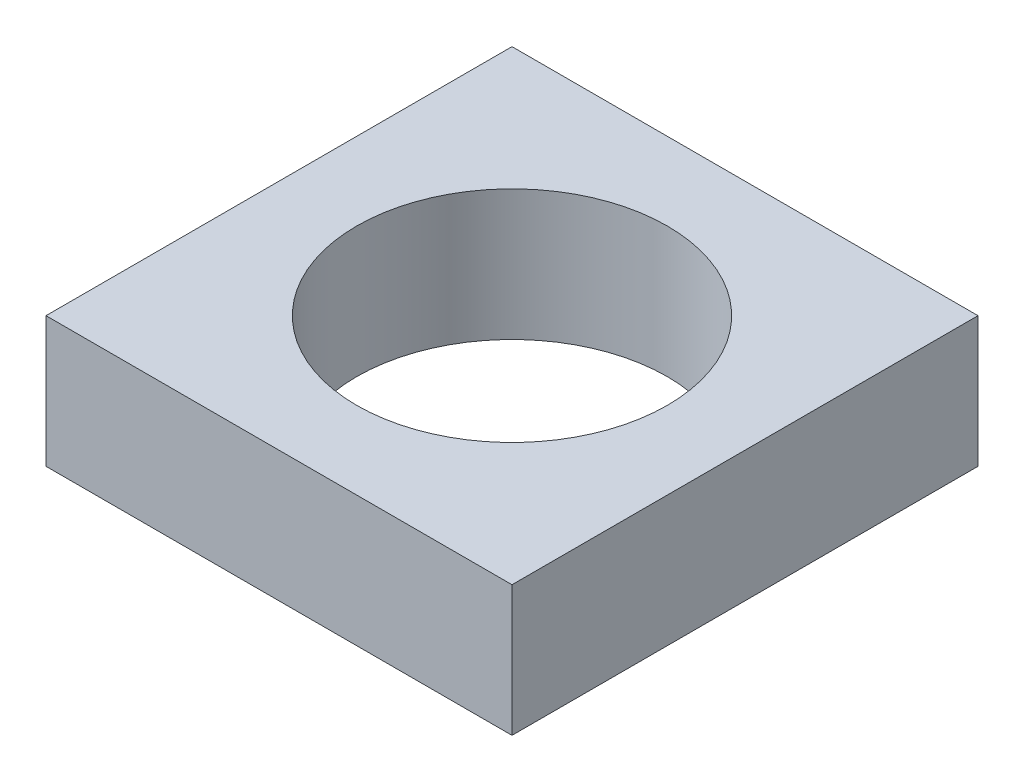
ISO-10303-21;
HEADER;
FILE_DESCRIPTION(('STEP AP214'),'2;1');
FILE_NAME('part.step','',(''),(''),'','','');
FILE_SCHEMA(('AUTOMOTIVE_DESIGN { 1 0 10303 214 1 1 1 1 }'));
ENDSEC;
DATA;
#1=APPLICATION_CONTEXT('core data for automotive mechanical design processes');
#2=APPLICATION_PROTOCOL_DEFINITION('international standard','automotive_design',2000,#1);
#3=PRODUCT_CONTEXT('',#1,'mechanical');
#4=PRODUCT('Part','Part','',(#3));
#5=PRODUCT_RELATED_PRODUCT_CATEGORY('part','',(#4));
#6=PRODUCT_DEFINITION_FORMATION('','',#4);
#7=PRODUCT_DEFINITION_CONTEXT('part definition',#1,'design');
#8=PRODUCT_DEFINITION('design','',#6,#7);
#9=PRODUCT_DEFINITION_SHAPE('','',#8);
#10=(LENGTH_UNIT() NAMED_UNIT(*) SI_UNIT(.MILLI.,.METRE.));
#11=(NAMED_UNIT(*) PLANE_ANGLE_UNIT() SI_UNIT($,.RADIAN.));
#12=(NAMED_UNIT(*) SI_UNIT($,.STERADIAN.) SOLID_ANGLE_UNIT());
#13=UNCERTAINTY_MEASURE_WITH_UNIT(LENGTH_MEASURE(1.E-05),#10,'distance_accuracy_value','');
#14=(GEOMETRIC_REPRESENTATION_CONTEXT(3) GLOBAL_UNCERTAINTY_ASSIGNED_CONTEXT((#13)) GLOBAL_UNIT_ASSIGNED_CONTEXT((#10,
#11,#12)) REPRESENTATION_CONTEXT('',''));
#15=CARTESIAN_POINT('',(0.,0.,0.));
#16=DIRECTION('',(0.,0.,1.));
#17=DIRECTION('',(1.,0.,0.));
#18=AXIS2_PLACEMENT_3D('',#15,#16,#17);
#19=CARTESIAN_POINT('',(19.05,10.668,19.05));
#20=DIRECTION('',(-1.,0.,0.));
#21=DIRECTION('',(0.,0.,1.));
#22=AXIS2_PLACEMENT_3D('',#19,#20,#21);
#23=PLANE('',#22);
#24=DIRECTION('',(0.,0.,-1.));
#25=VECTOR('',#24,1.);
#26=CARTESIAN_POINT('',(19.05,0.,19.05));
#27=LINE('',#26,#25);
#28=CARTESIAN_POINT('',(19.05,0.,19.05));
#29=VERTEX_POINT('',#28);
#30=CARTESIAN_POINT('',(19.05,0.,-19.05));
#31=VERTEX_POINT('',#30);
#32=EDGE_CURVE('E107',#29,#31,#27,.T.);
#33=ORIENTED_EDGE('',*,*,#32,.T.);
#34=DIRECTION('',(0.,-1.,0.));
#35=VECTOR('',#34,1.);
#36=CARTESIAN_POINT('',(19.05,10.668,-19.05));
#37=LINE('',#36,#35);
#38=CARTESIAN_POINT('',(19.05,10.668,-19.05));
#39=VERTEX_POINT('',#38);
#40=EDGE_CURVE('E11',#39,#31,#37,.T.);
#41=ORIENTED_EDGE('',*,*,#40,.F.);
#42=DIRECTION('',(0.,0.,-1.));
#43=VECTOR('',#42,1.);
#44=CARTESIAN_POINT('',(19.05,10.668,19.05));
#45=LINE('',#44,#43);
#46=CARTESIAN_POINT('',(19.05,10.668,19.05));
#47=VERTEX_POINT('',#46);
#48=EDGE_CURVE('E91',#47,#39,#45,.T.);
#49=ORIENTED_EDGE('',*,*,#48,.F.);
#50=DIRECTION('',(0.,-1.,0.));
#51=VECTOR('',#50,1.);
#52=CARTESIAN_POINT('',(19.05,10.668,19.05));
#53=LINE('',#52,#51);
#54=EDGE_CURVE('E103',#47,#29,#53,.T.);
#55=ORIENTED_EDGE('',*,*,#54,.T.);
#56=EDGE_LOOP('',(#33,#41,#49,#55));
#57=FACE_BOUND('',#56,.T.);
#58=ADVANCED_FACE('F39',(#57),#23,.F.);
#59=CARTESIAN_POINT('',(-19.05,10.668,-19.05));
#60=DIRECTION('',(0.,0.,1.));
#61=DIRECTION('',(1.,0.,0.));
#62=AXIS2_PLACEMENT_3D('',#59,#60,#61);
#63=PLANE('',#62);
#64=DIRECTION('',(-1.,0.,0.));
#65=VECTOR('',#64,1.);
#66=CARTESIAN_POINT('',(-19.05,0.,-19.05));
#67=LINE('',#66,#65);
#68=CARTESIAN_POINT('',(-19.05,0.,-19.05));
#69=VERTEX_POINT('',#68);
#70=EDGE_CURVE('E96',#31,#69,#67,.T.);
#71=ORIENTED_EDGE('',*,*,#70,.T.);
#72=DIRECTION('',(0.,-1.,0.));
#73=VECTOR('',#72,1.);
#74=CARTESIAN_POINT('',(-19.05,10.668,-19.05));
#75=LINE('',#74,#73);
#76=CARTESIAN_POINT('',(-19.05,10.668,-19.05));
#77=VERTEX_POINT('',#76);
#78=EDGE_CURVE('E48',#77,#69,#75,.T.);
#79=ORIENTED_EDGE('',*,*,#78,.F.);
#80=DIRECTION('',(-1.,0.,0.));
#81=VECTOR('',#80,1.);
#82=CARTESIAN_POINT('',(-19.05,10.668,-19.05));
#83=LINE('',#82,#81);
#84=EDGE_CURVE('E86',#39,#77,#83,.T.);
#85=ORIENTED_EDGE('',*,*,#84,.F.);
#86=ORIENTED_EDGE('',*,*,#40,.T.);
#87=EDGE_LOOP('',(#71,#79,#85,#86));
#88=FACE_BOUND('',#87,.T.);
#89=ADVANCED_FACE('F95',(#88),#63,.F.);
#90=CARTESIAN_POINT('',(-19.05,10.668,19.05));
#91=DIRECTION('',(1.,0.,0.));
#92=DIRECTION('',(0.,0.,-1.));
#93=AXIS2_PLACEMENT_3D('',#90,#91,#92);
#94=PLANE('',#93);
#95=DIRECTION('',(0.,0.,1.));
#96=VECTOR('',#95,1.);
#97=CARTESIAN_POINT('',(-19.05,0.,19.05));
#98=LINE('',#97,#96);
#99=CARTESIAN_POINT('',(-19.05,0.,19.05));
#100=VERTEX_POINT('',#99);
#101=EDGE_CURVE('E73',#69,#100,#98,.T.);
#102=ORIENTED_EDGE('',*,*,#101,.T.);
#103=DIRECTION('',(0.,-1.,0.));
#104=VECTOR('',#103,1.);
#105=CARTESIAN_POINT('',(-19.05,10.668,19.05));
#106=LINE('',#105,#104);
#107=CARTESIAN_POINT('',(-19.05,10.668,19.05));
#108=VERTEX_POINT('',#107);
#109=EDGE_CURVE('E98',#108,#100,#106,.T.);
#110=ORIENTED_EDGE('',*,*,#109,.F.);
#111=DIRECTION('',(0.,0.,1.));
#112=VECTOR('',#111,1.);
#113=CARTESIAN_POINT('',(-19.05,10.668,19.05));
#114=LINE('',#113,#112);
#115=EDGE_CURVE('E89',#77,#108,#114,.T.);
#116=ORIENTED_EDGE('',*,*,#115,.F.);
#117=ORIENTED_EDGE('',*,*,#78,.T.);
#118=EDGE_LOOP('',(#102,#110,#116,#117));
#119=FACE_BOUND('',#118,.T.);
#120=ADVANCED_FACE('F99',(#119),#94,.F.);
#121=CARTESIAN_POINT('',(-19.05,10.668,19.05));
#122=DIRECTION('',(0.,0.,-1.));
#123=DIRECTION('',(-1.,0.,0.));
#124=AXIS2_PLACEMENT_3D('',#121,#122,#123);
#125=PLANE('',#124);
#126=DIRECTION('',(1.,0.,0.));
#127=VECTOR('',#126,1.);
#128=CARTESIAN_POINT('',(-19.05,0.,19.05));
#129=LINE('',#128,#127);
#130=EDGE_CURVE('E79',#100,#29,#129,.T.);
#131=ORIENTED_EDGE('',*,*,#130,.T.);
#132=ORIENTED_EDGE('',*,*,#54,.F.);
#133=DIRECTION('',(1.,0.,0.));
#134=VECTOR('',#133,1.);
#135=CARTESIAN_POINT('',(-19.05,10.668,19.05));
#136=LINE('',#135,#134);
#137=EDGE_CURVE('E56',#108,#47,#136,.T.);
#138=ORIENTED_EDGE('',*,*,#137,.F.);
#139=ORIENTED_EDGE('',*,*,#109,.T.);
#140=EDGE_LOOP('',(#131,#132,#138,#139));
#141=FACE_BOUND('',#140,.T.);
#142=ADVANCED_FACE('F121',(#141),#125,.F.);
#143=CARTESIAN_POINT('',(0.,10.668,0.));
#144=DIRECTION('',(0.,-1.,0.));
#145=DIRECTION('',(0.,0.,-1.));
#146=AXIS2_PLACEMENT_3D('',#143,#144,#145);
#147=PLANE('',#146);
#148=CARTESIAN_POINT('',(0.,10.668,0.));
#149=DIRECTION('',(0.,1.,0.));
#150=DIRECTION('',(0.,0.,1.));
#151=AXIS2_PLACEMENT_3D('',#148,#149,#150);
#152=CIRCLE('',#151,12.7);
#153=CARTESIAN_POINT('',(0.,10.668,12.7));
#154=VERTEX_POINT('',#153);
#155=EDGE_CURVE('E128',#154,#154,#152,.T.);
#156=ORIENTED_EDGE('',*,*,#155,.F.);
#157=EDGE_LOOP('',(#156));
#158=FACE_BOUND('',#157,.T.);
#159=ORIENTED_EDGE('',*,*,#48,.T.);
#160=ORIENTED_EDGE('',*,*,#84,.T.);
#161=ORIENTED_EDGE('',*,*,#115,.T.);
#162=ORIENTED_EDGE('',*,*,#137,.T.);
#163=EDGE_LOOP('',(#159,#160,#161,#162));
#164=FACE_BOUND('',#163,.T.);
#165=ADVANCED_FACE('F87',(#158,#164),#147,.F.);
#166=CARTESIAN_POINT('',(0.,0.,0.));
#167=DIRECTION('',(0.,-1.,0.));
#168=DIRECTION('',(0.,0.,-1.));
#169=AXIS2_PLACEMENT_3D('',#166,#167,#168);
#170=PLANE('',#169);
#171=CARTESIAN_POINT('',(0.,0.,0.));
#172=DIRECTION('',(0.,1.,0.));
#173=DIRECTION('',(0.,0.,1.));
#174=AXIS2_PLACEMENT_3D('',#171,#172,#173);
#175=CIRCLE('',#174,12.7);
#176=CARTESIAN_POINT('',(0.,0.,12.7));
#177=VERTEX_POINT('',#176);
#178=EDGE_CURVE('E111',#177,#177,#175,.T.);
#179=ORIENTED_EDGE('',*,*,#178,.T.);
#180=EDGE_LOOP('',(#179));
#181=FACE_BOUND('',#180,.T.);
#182=ORIENTED_EDGE('',*,*,#32,.F.);
#183=ORIENTED_EDGE('',*,*,#130,.F.);
#184=ORIENTED_EDGE('',*,*,#101,.F.);
#185=ORIENTED_EDGE('',*,*,#70,.F.);
#186=EDGE_LOOP('',(#182,#183,#184,#185));
#187=FACE_BOUND('',#186,.T.);
#188=ADVANCED_FACE('F124',(#181,#187),#170,.T.);
#189=CARTESIAN_POINT('',(0.,0.,0.));
#190=DIRECTION('',(0.,1.,0.));
#191=DIRECTION('',(0.,0.,1.));
#192=AXIS2_PLACEMENT_3D('',#189,#190,#191);
#193=CYLINDRICAL_SURFACE('',#192,12.7);
#194=ORIENTED_EDGE('',*,*,#178,.F.);
#195=EDGE_LOOP('',(#194));
#196=FACE_BOUND('',#195,.T.);
#197=ORIENTED_EDGE('',*,*,#155,.T.);
#198=EDGE_LOOP('',(#197));
#199=FACE_BOUND('',#198,.T.);
#200=ADVANCED_FACE('F137',(#196,#199),#193,.F.);
#201=CLOSED_SHELL('',(#58,#89,#120,#142,#165,#188,#200));
#202=MANIFOLD_SOLID_BREP('B2',#201);
#203=ADVANCED_BREP_SHAPE_REPRESENTATION('',(#18,#202),#14);
#204=SHAPE_DEFINITION_REPRESENTATION(#9,#203);
ENDSEC;
END-ISO-10303-21;
